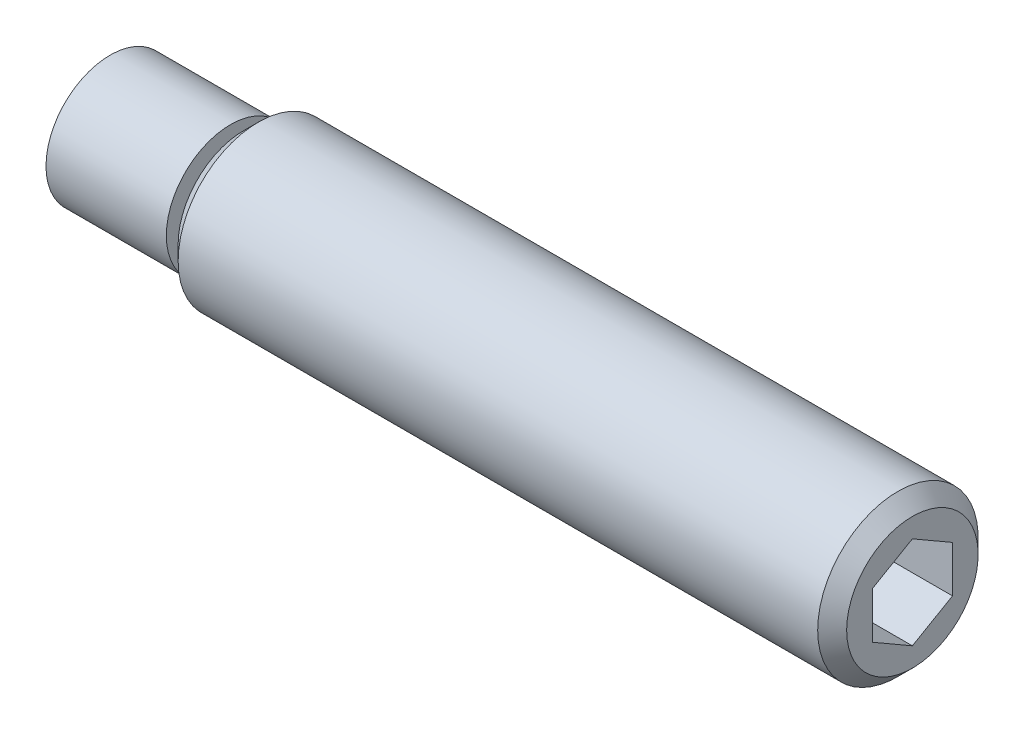
ISO-10303-21;
HEADER;
FILE_DESCRIPTION(('STEP AP214'),'2;1');
FILE_NAME('part.step','',(''),(''),'','','');
FILE_SCHEMA(('AUTOMOTIVE_DESIGN { 1 0 10303 214 1 1 1 1 }'));
ENDSEC;
DATA;
#1=APPLICATION_CONTEXT('core data for automotive mechanical design processes');
#2=APPLICATION_PROTOCOL_DEFINITION('international standard','automotive_design',2000,#1);
#3=PRODUCT_CONTEXT('',#1,'mechanical');
#4=PRODUCT('Part','Part','',(#3));
#5=PRODUCT_RELATED_PRODUCT_CATEGORY('part','',(#4));
#6=PRODUCT_DEFINITION_FORMATION('','',#4);
#7=PRODUCT_DEFINITION_CONTEXT('part definition',#1,'design');
#8=PRODUCT_DEFINITION('design','',#6,#7);
#9=PRODUCT_DEFINITION_SHAPE('','',#8);
#10=(LENGTH_UNIT() NAMED_UNIT(*) SI_UNIT(.MILLI.,.METRE.));
#11=(NAMED_UNIT(*) PLANE_ANGLE_UNIT() SI_UNIT($,.RADIAN.));
#12=(NAMED_UNIT(*) SI_UNIT($,.STERADIAN.) SOLID_ANGLE_UNIT());
#13=UNCERTAINTY_MEASURE_WITH_UNIT(LENGTH_MEASURE(1.E-05),#10,'distance_accuracy_value','');
#14=(GEOMETRIC_REPRESENTATION_CONTEXT(3) GLOBAL_UNCERTAINTY_ASSIGNED_CONTEXT((#13)) GLOBAL_UNIT_ASSIGNED_CONTEXT((#10,
#11,#12)) REPRESENTATION_CONTEXT('',''));
#15=CARTESIAN_POINT('',(0.,0.,0.));
#16=DIRECTION('',(0.,0.,1.));
#17=DIRECTION('',(1.,0.,0.));
#18=AXIS2_PLACEMENT_3D('',#15,#16,#17);
#19=CARTESIAN_POINT('',(25.,2.4585,0.));
#20=DIRECTION('',(-1.,0.,0.));
#21=DIRECTION('',(0.,0.,1.));
#22=AXIS2_PLACEMENT_3D('',#19,#20,#21);
#23=PLANE('',#22);
#24=CARTESIAN_POINT('',(25.,0.,0.));
#25=DIRECTION('',(-1.,0.,0.));
#26=DIRECTION('',(0.,0.,1.));
#27=AXIS2_PLACEMENT_3D('',#24,#25,#26);
#28=CIRCLE('',#27,2.4585);
#29=CARTESIAN_POINT('',(25.,0.,2.4585));
#30=VERTEX_POINT('',#29);
#31=EDGE_CURVE('E175',#30,#30,#28,.T.);
#32=ORIENTED_EDGE('',*,*,#31,.F.);
#33=EDGE_LOOP('',(#32));
#34=FACE_BOUND('',#33,.T.);
#35=DIRECTION('',(0.,-1.,0.));
#36=VECTOR('',#35,1.);
#37=CARTESIAN_POINT('',(25.,0.866025403784439,1.5));
#38=LINE('',#37,#36);
#39=CARTESIAN_POINT('',(25.,0.866025403784439,1.5));
#40=VERTEX_POINT('',#39);
#41=CARTESIAN_POINT('',(25.,-0.866025403784439,1.5));
#42=VERTEX_POINT('',#41);
#43=EDGE_CURVE('E150',#40,#42,#38,.T.);
#44=ORIENTED_EDGE('',*,*,#43,.F.);
#45=DIRECTION('',(0.,-0.5,0.866025403784439));
#46=VECTOR('',#45,1.);
#47=CARTESIAN_POINT('',(25.,1.73205080756888,0.));
#48=LINE('',#47,#46);
#49=CARTESIAN_POINT('',(25.,1.73205080756888,0.));
#50=VERTEX_POINT('',#49);
#51=EDGE_CURVE('E51',#50,#40,#48,.T.);
#52=ORIENTED_EDGE('',*,*,#51,.F.);
#53=DIRECTION('',(0.,0.5,0.866025403784439));
#54=VECTOR('',#53,1.);
#55=CARTESIAN_POINT('',(25.,0.866025403784439,-1.5));
#56=LINE('',#55,#54);
#57=CARTESIAN_POINT('',(25.,0.866025403784439,-1.5));
#58=VERTEX_POINT('',#57);
#59=EDGE_CURVE('E121',#58,#50,#56,.T.);
#60=ORIENTED_EDGE('',*,*,#59,.F.);
#61=DIRECTION('',(0.,1.,0.));
#62=VECTOR('',#61,1.);
#63=CARTESIAN_POINT('',(25.,-0.866025403784439,-1.5));
#64=LINE('',#63,#62);
#65=CARTESIAN_POINT('',(25.,-0.866025403784439,-1.5));
#66=VERTEX_POINT('',#65);
#67=EDGE_CURVE('E157',#66,#58,#64,.T.);
#68=ORIENTED_EDGE('',*,*,#67,.F.);
#69=DIRECTION('',(0.,0.5,-0.866025403784439));
#70=VECTOR('',#69,1.);
#71=CARTESIAN_POINT('',(25.,-1.73205080756888,0.));
#72=LINE('',#71,#70);
#73=CARTESIAN_POINT('',(25.,-1.73205080756888,0.));
#74=VERTEX_POINT('',#73);
#75=EDGE_CURVE('E154',#74,#66,#72,.T.);
#76=ORIENTED_EDGE('',*,*,#75,.F.);
#77=DIRECTION('',(0.,-0.5,-0.866025403784439));
#78=VECTOR('',#77,1.);
#79=CARTESIAN_POINT('',(25.,-0.866025403784439,1.5));
#80=LINE('',#79,#78);
#81=EDGE_CURVE('E152',#42,#74,#80,.T.);
#82=ORIENTED_EDGE('',*,*,#81,.F.);
#83=EDGE_LOOP('',(#44,#52,#60,#68,#76,#82));
#84=FACE_BOUND('',#83,.T.);
#85=ADVANCED_FACE('F36',(#34,#84),#23,.F.);
#86=CARTESIAN_POINT('',(-5.,0.,0.));
#87=DIRECTION('',(1.,0.,0.));
#88=DIRECTION('',(0.,0.,-1.));
#89=AXIS2_PLACEMENT_3D('',#86,#87,#88);
#90=PLANE('',#89);
#91=CARTESIAN_POINT('',(-5.,0.,0.));
#92=DIRECTION('',(-1.,0.,0.));
#93=DIRECTION('',(0.,0.,1.));
#94=AXIS2_PLACEMENT_3D('',#91,#92,#93);
#95=CIRCLE('',#94,2.4);
#96=CARTESIAN_POINT('',(-5.,0.,2.4));
#97=VERTEX_POINT('',#96);
#98=EDGE_CURVE('E11',#97,#97,#95,.T.);
#99=ORIENTED_EDGE('',*,*,#98,.T.);
#100=EDGE_LOOP('',(#99));
#101=FACE_BOUND('',#100,.T.);
#102=ADVANCED_FACE('F38',(#101),#90,.F.);
#103=CARTESIAN_POINT('',(25.,0.,0.));
#104=DIRECTION('',(-1.,0.,0.));
#105=DIRECTION('',(0.,0.,1.));
#106=AXIS2_PLACEMENT_3D('',#103,#104,#105);
#107=CYLINDRICAL_SURFACE('',#106,2.4);
#108=ORIENTED_EDGE('',*,*,#98,.F.);
#109=EDGE_LOOP('',(#108));
#110=FACE_BOUND('',#109,.T.);
#111=CARTESIAN_POINT('',(-0.5,0.,0.));
#112=DIRECTION('',(-1.,0.,0.));
#113=DIRECTION('',(0.,0.,1.));
#114=AXIS2_PLACEMENT_3D('',#111,#112,#113);
#115=CIRCLE('',#114,2.4);
#116=CARTESIAN_POINT('',(-0.5,0.,2.4));
#117=VERTEX_POINT('',#116);
#118=EDGE_CURVE('E44',#117,#117,#115,.T.);
#119=ORIENTED_EDGE('',*,*,#118,.T.);
#120=EDGE_LOOP('',(#119));
#121=FACE_BOUND('',#120,.T.);
#122=ADVANCED_FACE('F196',(#110,#121),#107,.T.);
#123=CARTESIAN_POINT('',(-0.5,2.4,0.));
#124=DIRECTION('',(-1.,0.,0.));
#125=DIRECTION('',(0.,0.,1.));
#126=AXIS2_PLACEMENT_3D('',#123,#124,#125);
#127=PLANE('',#126);
#128=ORIENTED_EDGE('',*,*,#118,.F.);
#129=EDGE_LOOP('',(#128));
#130=FACE_BOUND('',#129,.T.);
#131=CARTESIAN_POINT('',(-0.5,0.,0.));
#132=DIRECTION('',(-1.,0.,0.));
#133=DIRECTION('',(0.,0.,1.));
#134=AXIS2_PLACEMENT_3D('',#131,#132,#133);
#135=CIRCLE('',#134,1.5);
#136=CARTESIAN_POINT('',(-0.5,0.,1.5));
#137=VERTEX_POINT('',#136);
#138=EDGE_CURVE('E191',#137,#137,#135,.T.);
#139=ORIENTED_EDGE('',*,*,#138,.T.);
#140=EDGE_LOOP('',(#139));
#141=FACE_BOUND('',#140,.T.);
#142=ADVANCED_FACE('F198',(#130,#141),#127,.F.);
#143=CARTESIAN_POINT('',(25.,0.,0.));
#144=DIRECTION('',(-1.,0.,0.));
#145=DIRECTION('',(0.,0.,1.));
#146=AXIS2_PLACEMENT_3D('',#143,#144,#145);
#147=CYLINDRICAL_SURFACE('',#146,1.5);
#148=ORIENTED_EDGE('',*,*,#138,.F.);
#149=EDGE_LOOP('',(#148));
#150=FACE_BOUND('',#149,.T.);
#151=CARTESIAN_POINT('',(0.,0.,0.));
#152=DIRECTION('',(-1.,0.,0.));
#153=DIRECTION('',(0.,0.,1.));
#154=AXIS2_PLACEMENT_3D('',#151,#152,#153);
#155=CIRCLE('',#154,1.5);
#156=CARTESIAN_POINT('',(0.,0.,1.5));
#157=VERTEX_POINT('',#156);
#158=EDGE_CURVE('E188',#157,#157,#155,.T.);
#159=ORIENTED_EDGE('',*,*,#158,.T.);
#160=EDGE_LOOP('',(#159));
#161=FACE_BOUND('',#160,.T.);
#162=ADVANCED_FACE('F201',(#150,#161),#147,.T.);
#163=CARTESIAN_POINT('',(0.,1.5,0.));
#164=DIRECTION('',(1.,0.,0.));
#165=DIRECTION('',(0.,0.,-1.));
#166=AXIS2_PLACEMENT_3D('',#163,#164,#165);
#167=PLANE('',#166);
#168=ORIENTED_EDGE('',*,*,#158,.F.);
#169=EDGE_LOOP('',(#168));
#170=FACE_BOUND('',#169,.T.);
#171=CARTESIAN_POINT('',(0.,0.,0.));
#172=DIRECTION('',(-1.,0.,0.));
#173=DIRECTION('',(0.,0.,1.));
#174=AXIS2_PLACEMENT_3D('',#171,#172,#173);
#175=CIRCLE('',#174,2.4585);
#176=CARTESIAN_POINT('',(0.,0.,2.4585));
#177=VERTEX_POINT('',#176);
#178=EDGE_CURVE('E185',#177,#177,#175,.T.);
#179=ORIENTED_EDGE('',*,*,#178,.T.);
#180=EDGE_LOOP('',(#179));
#181=FACE_BOUND('',#180,.T.);
#182=ADVANCED_FACE('F207',(#170,#181),#167,.F.);
#183=CARTESIAN_POINT('',(0.541500000000004,0.,0.));
#184=DIRECTION('',(1.,0.,0.));
#185=DIRECTION('',(0.,0.,-1.));
#186=AXIS2_PLACEMENT_3D('',#183,#184,#185);
#187=CONICAL_SURFACE('',#186,3.,0.785398163397445);
#188=ORIENTED_EDGE('',*,*,#178,.F.);
#189=EDGE_LOOP('',(#188));
#190=FACE_BOUND('',#189,.T.);
#191=CARTESIAN_POINT('',(0.541500000000004,0.,0.));
#192=DIRECTION('',(-1.,0.,0.));
#193=DIRECTION('',(0.,0.,1.));
#194=AXIS2_PLACEMENT_3D('',#191,#192,#193);
#195=CIRCLE('',#194,3.);
#196=CARTESIAN_POINT('',(0.541500000000004,0.,3.));
#197=VERTEX_POINT('',#196);
#198=EDGE_CURVE('E182',#197,#197,#195,.T.);
#199=ORIENTED_EDGE('',*,*,#198,.T.);
#200=EDGE_LOOP('',(#199));
#201=FACE_BOUND('',#200,.T.);
#202=ADVANCED_FACE('F213',(#190,#201),#187,.T.);
#203=CARTESIAN_POINT('',(25.,0.,0.));
#204=DIRECTION('',(-1.,0.,0.));
#205=DIRECTION('',(0.,0.,1.));
#206=AXIS2_PLACEMENT_3D('',#203,#204,#205);
#207=CYLINDRICAL_SURFACE('',#206,3.);
#208=ORIENTED_EDGE('',*,*,#198,.F.);
#209=EDGE_LOOP('',(#208));
#210=FACE_BOUND('',#209,.T.);
#211=CARTESIAN_POINT('',(24.4585,0.,0.));
#212=DIRECTION('',(-1.,0.,0.));
#213=DIRECTION('',(0.,0.,1.));
#214=AXIS2_PLACEMENT_3D('',#211,#212,#213);
#215=CIRCLE('',#214,3.);
#216=CARTESIAN_POINT('',(24.4585,0.,3.));
#217=VERTEX_POINT('',#216);
#218=EDGE_CURVE('E179',#217,#217,#215,.T.);
#219=ORIENTED_EDGE('',*,*,#218,.T.);
#220=EDGE_LOOP('',(#219));
#221=FACE_BOUND('',#220,.T.);
#222=ADVANCED_FACE('F219',(#210,#221),#207,.T.);
#223=CARTESIAN_POINT('',(25.,0.,0.));
#224=DIRECTION('',(-1.,0.,0.));
#225=DIRECTION('',(0.,0.,1.));
#226=AXIS2_PLACEMENT_3D('',#223,#224,#225);
#227=CONICAL_SURFACE('',#226,2.4585,0.785398163397448);
#228=ORIENTED_EDGE('',*,*,#218,.F.);
#229=EDGE_LOOP('',(#228));
#230=FACE_BOUND('',#229,.T.);
#231=ORIENTED_EDGE('',*,*,#31,.T.);
#232=EDGE_LOOP('',(#231));
#233=FACE_BOUND('',#232,.T.);
#234=ADVANCED_FACE('F225',(#230,#233),#227,.T.);
#235=CARTESIAN_POINT('',(22.,1.73205080756888,0.));
#236=DIRECTION('',(0.,0.866025403784439,0.5));
#237=DIRECTION('',(0.,-0.5,0.866025403784439));
#238=AXIS2_PLACEMENT_3D('',#235,#236,#237);
#239=PLANE('',#238);
#240=ORIENTED_EDGE('',*,*,#51,.T.);
#241=DIRECTION('',(1.,0.,0.));
#242=VECTOR('',#241,1.);
#243=CARTESIAN_POINT('',(22.,0.866025403784439,1.5));
#244=LINE('',#243,#242);
#245=CARTESIAN_POINT('',(22.,0.866025403784439,1.5));
#246=VERTEX_POINT('',#245);
#247=EDGE_CURVE('E123',#246,#40,#244,.T.);
#248=ORIENTED_EDGE('',*,*,#247,.F.);
#249=DIRECTION('',(0.,-0.5,0.866025403784439));
#250=VECTOR('',#249,1.);
#251=CARTESIAN_POINT('',(22.,1.73205080756888,0.));
#252=LINE('',#251,#250);
#253=CARTESIAN_POINT('',(22.,1.29903810567666,0.75));
#254=VERTEX_POINT('',#253);
#255=EDGE_CURVE('E112',#254,#246,#252,.T.);
#256=ORIENTED_EDGE('',*,*,#255,.F.);
#257=CARTESIAN_POINT('',(22.,1.73205080756888,0.));
#258=VERTEX_POINT('',#257);
#259=EDGE_CURVE('E120',#258,#254,#252,.T.);
#260=ORIENTED_EDGE('',*,*,#259,.F.);
#261=DIRECTION('',(1.,0.,0.));
#262=VECTOR('',#261,1.);
#263=CARTESIAN_POINT('',(22.,1.73205080756888,0.));
#264=LINE('',#263,#262);
#265=EDGE_CURVE('E160',#258,#50,#264,.T.);
#266=ORIENTED_EDGE('',*,*,#265,.T.);
#267=EDGE_LOOP('',(#240,#248,#256,#260,#266));
#268=FACE_BOUND('',#267,.T.);
#269=ADVANCED_FACE('F124',(#268),#239,.F.);
#270=CARTESIAN_POINT('',(22.,0.866025403784439,-1.5));
#271=DIRECTION('',(0.,0.866025403784439,-0.5));
#272=DIRECTION('',(0.,0.5,0.866025403784439));
#273=AXIS2_PLACEMENT_3D('',#270,#271,#272);
#274=PLANE('',#273);
#275=ORIENTED_EDGE('',*,*,#59,.T.);
#276=ORIENTED_EDGE('',*,*,#265,.F.);
#277=DIRECTION('',(0.,0.5,0.866025403784439));
#278=VECTOR('',#277,1.);
#279=CARTESIAN_POINT('',(22.,0.866025403784439,-1.5));
#280=LINE('',#279,#278);
#281=CARTESIAN_POINT('',(22.,1.29903810567666,-0.75));
#282=VERTEX_POINT('',#281);
#283=EDGE_CURVE('E146',#282,#258,#280,.T.);
#284=ORIENTED_EDGE('',*,*,#283,.F.);
#285=CARTESIAN_POINT('',(22.,0.866025403784439,-1.5));
#286=VERTEX_POINT('',#285);
#287=EDGE_CURVE('E128',#286,#282,#280,.T.);
#288=ORIENTED_EDGE('',*,*,#287,.F.);
#289=DIRECTION('',(1.,0.,0.));
#290=VECTOR('',#289,1.);
#291=CARTESIAN_POINT('',(22.,0.866025403784439,-1.5));
#292=LINE('',#291,#290);
#293=EDGE_CURVE('E163',#286,#58,#292,.T.);
#294=ORIENTED_EDGE('',*,*,#293,.T.);
#295=EDGE_LOOP('',(#275,#276,#284,#288,#294));
#296=FACE_BOUND('',#295,.T.);
#297=ADVANCED_FACE('F267',(#296),#274,.F.);
#298=CARTESIAN_POINT('',(22.,-0.866025403784439,-1.5));
#299=DIRECTION('',(0.,0.,-1.));
#300=DIRECTION('',(-1.,0.,0.));
#301=AXIS2_PLACEMENT_3D('',#298,#299,#300);
#302=PLANE('',#301);
#303=ORIENTED_EDGE('',*,*,#67,.T.);
#304=ORIENTED_EDGE('',*,*,#293,.F.);
#305=DIRECTION('',(0.,1.,0.));
#306=VECTOR('',#305,1.);
#307=CARTESIAN_POINT('',(22.,-0.866025403784439,-1.5));
#308=LINE('',#307,#306);
#309=CARTESIAN_POINT('',(22.,0.,-1.5));
#310=VERTEX_POINT('',#309);
#311=EDGE_CURVE('E144',#310,#286,#308,.T.);
#312=ORIENTED_EDGE('',*,*,#311,.F.);
#313=CARTESIAN_POINT('',(22.,-0.866025403784439,-1.5));
#314=VERTEX_POINT('',#313);
#315=EDGE_CURVE('E59',#314,#310,#308,.T.);
#316=ORIENTED_EDGE('',*,*,#315,.F.);
#317=DIRECTION('',(1.,0.,0.));
#318=VECTOR('',#317,1.);
#319=CARTESIAN_POINT('',(22.,-0.866025403784439,-1.5));
#320=LINE('',#319,#318);
#321=EDGE_CURVE('E166',#314,#66,#320,.T.);
#322=ORIENTED_EDGE('',*,*,#321,.T.);
#323=EDGE_LOOP('',(#303,#304,#312,#316,#322));
#324=FACE_BOUND('',#323,.T.);
#325=ADVANCED_FACE('F271',(#324),#302,.F.);
#326=CARTESIAN_POINT('',(22.,-1.73205080756888,0.));
#327=DIRECTION('',(0.,-0.866025403784439,-0.5));
#328=DIRECTION('',(0.,0.5,-0.866025403784439));
#329=AXIS2_PLACEMENT_3D('',#326,#327,#328);
#330=PLANE('',#329);
#331=ORIENTED_EDGE('',*,*,#75,.T.);
#332=ORIENTED_EDGE('',*,*,#321,.F.);
#333=DIRECTION('',(0.,0.5,-0.866025403784439));
#334=VECTOR('',#333,1.);
#335=CARTESIAN_POINT('',(22.,-1.73205080756888,0.));
#336=LINE('',#335,#334);
#337=CARTESIAN_POINT('',(22.,-1.29903810567666,-0.75));
#338=VERTEX_POINT('',#337);
#339=EDGE_CURVE('E140',#338,#314,#336,.T.);
#340=ORIENTED_EDGE('',*,*,#339,.F.);
#341=CARTESIAN_POINT('',(22.,-1.73205080756888,0.));
#342=VERTEX_POINT('',#341);
#343=EDGE_CURVE('E141',#342,#338,#336,.T.);
#344=ORIENTED_EDGE('',*,*,#343,.F.);
#345=DIRECTION('',(1.,0.,0.));
#346=VECTOR('',#345,1.);
#347=CARTESIAN_POINT('',(22.,-1.73205080756888,0.));
#348=LINE('',#347,#346);
#349=EDGE_CURVE('E169',#342,#74,#348,.T.);
#350=ORIENTED_EDGE('',*,*,#349,.T.);
#351=EDGE_LOOP('',(#331,#332,#340,#344,#350));
#352=FACE_BOUND('',#351,.T.);
#353=ADVANCED_FACE('F274',(#352),#330,.F.);
#354=CARTESIAN_POINT('',(22.,-0.866025403784439,1.5));
#355=DIRECTION('',(0.,-0.866025403784439,0.5));
#356=DIRECTION('',(0.,-0.5,-0.866025403784439));
#357=AXIS2_PLACEMENT_3D('',#354,#355,#356);
#358=PLANE('',#357);
#359=ORIENTED_EDGE('',*,*,#81,.T.);
#360=ORIENTED_EDGE('',*,*,#349,.F.);
#361=DIRECTION('',(0.,-0.5,-0.866025403784439));
#362=VECTOR('',#361,1.);
#363=CARTESIAN_POINT('',(22.,-0.866025403784439,1.5));
#364=LINE('',#363,#362);
#365=CARTESIAN_POINT('',(22.,-1.29903810567666,0.75));
#366=VERTEX_POINT('',#365);
#367=EDGE_CURVE('E134',#366,#342,#364,.T.);
#368=ORIENTED_EDGE('',*,*,#367,.F.);
#369=CARTESIAN_POINT('',(22.,-0.866025403784439,1.5));
#370=VERTEX_POINT('',#369);
#371=EDGE_CURVE('E136',#370,#366,#364,.T.);
#372=ORIENTED_EDGE('',*,*,#371,.F.);
#373=DIRECTION('',(1.,0.,0.));
#374=VECTOR('',#373,1.);
#375=CARTESIAN_POINT('',(22.,-0.866025403784439,1.5));
#376=LINE('',#375,#374);
#377=EDGE_CURVE('E127',#370,#42,#376,.T.);
#378=ORIENTED_EDGE('',*,*,#377,.T.);
#379=EDGE_LOOP('',(#359,#360,#368,#372,#378));
#380=FACE_BOUND('',#379,.T.);
#381=ADVANCED_FACE('F242',(#380),#358,.F.);
#382=CARTESIAN_POINT('',(22.,0.866025403784439,1.5));
#383=DIRECTION('',(0.,0.,1.));
#384=DIRECTION('',(1.,0.,0.));
#385=AXIS2_PLACEMENT_3D('',#382,#383,#384);
#386=PLANE('',#385);
#387=ORIENTED_EDGE('',*,*,#43,.T.);
#388=ORIENTED_EDGE('',*,*,#377,.F.);
#389=DIRECTION('',(0.,-1.,0.));
#390=VECTOR('',#389,1.);
#391=CARTESIAN_POINT('',(22.,0.866025403784439,1.5));
#392=LINE('',#391,#390);
#393=CARTESIAN_POINT('',(22.,0.,1.5));
#394=VERTEX_POINT('',#393);
#395=EDGE_CURVE('E133',#394,#370,#392,.T.);
#396=ORIENTED_EDGE('',*,*,#395,.F.);
#397=EDGE_CURVE('E115',#246,#394,#392,.T.);
#398=ORIENTED_EDGE('',*,*,#397,.F.);
#399=ORIENTED_EDGE('',*,*,#247,.T.);
#400=EDGE_LOOP('',(#387,#388,#396,#398,#399));
#401=FACE_BOUND('',#400,.T.);
#402=ADVANCED_FACE('F131',(#401),#386,.F.);
#403=CARTESIAN_POINT('',(22.,0.866025403784438,1.5));
#404=DIRECTION('',(1.,0.,0.));
#405=DIRECTION('',(0.,0.,-1.));
#406=AXIS2_PLACEMENT_3D('',#403,#404,#405);
#407=PLANE('',#406);
#408=ORIENTED_EDGE('',*,*,#311,.T.);
#409=ORIENTED_EDGE('',*,*,#287,.T.);
#410=CARTESIAN_POINT('',(22.,0.,0.));
#411=DIRECTION('',(-1.,0.,0.));
#412=DIRECTION('',(0.,0.,1.));
#413=AXIS2_PLACEMENT_3D('',#410,#411,#412);
#414=CIRCLE('',#413,1.5);
#415=EDGE_CURVE('E256',#282,#310,#414,.T.);
#416=ORIENTED_EDGE('',*,*,#415,.T.);
#417=EDGE_LOOP('',(#408,#409,#416));
#418=FACE_BOUND('',#417,.T.);
#419=ADVANCED_FACE('F268',(#418),#407,.T.);
#420=ORIENTED_EDGE('',*,*,#283,.T.);
#421=ORIENTED_EDGE('',*,*,#259,.T.);
#422=EDGE_CURVE('E176',#254,#282,#414,.T.);
#423=ORIENTED_EDGE('',*,*,#422,.T.);
#424=EDGE_LOOP('',(#420,#421,#423));
#425=FACE_BOUND('',#424,.T.);
#426=ADVANCED_FACE('F263',(#425),#407,.T.);
#427=ORIENTED_EDGE('',*,*,#255,.T.);
#428=ORIENTED_EDGE('',*,*,#397,.T.);
#429=EDGE_CURVE('E117',#394,#254,#414,.T.);
#430=ORIENTED_EDGE('',*,*,#429,.T.);
#431=EDGE_LOOP('',(#427,#428,#430));
#432=FACE_BOUND('',#431,.T.);
#433=ADVANCED_FACE('F113',(#432),#407,.T.);
#434=ORIENTED_EDGE('',*,*,#395,.T.);
#435=ORIENTED_EDGE('',*,*,#371,.T.);
#436=EDGE_CURVE('E162',#366,#394,#414,.T.);
#437=ORIENTED_EDGE('',*,*,#436,.T.);
#438=EDGE_LOOP('',(#434,#435,#437));
#439=FACE_BOUND('',#438,.T.);
#440=ADVANCED_FACE('F247',(#439),#407,.T.);
#441=ORIENTED_EDGE('',*,*,#367,.T.);
#442=ORIENTED_EDGE('',*,*,#343,.T.);
#443=EDGE_CURVE('E252',#338,#366,#414,.T.);
#444=ORIENTED_EDGE('',*,*,#443,.T.);
#445=EDGE_LOOP('',(#441,#442,#444));
#446=FACE_BOUND('',#445,.T.);
#447=ADVANCED_FACE('F276',(#446),#407,.T.);
#448=ORIENTED_EDGE('',*,*,#339,.T.);
#449=ORIENTED_EDGE('',*,*,#315,.T.);
#450=EDGE_CURVE('E254',#310,#338,#414,.T.);
#451=ORIENTED_EDGE('',*,*,#450,.T.);
#452=EDGE_LOOP('',(#448,#449,#451));
#453=FACE_BOUND('',#452,.T.);
#454=ADVANCED_FACE('F278',(#453),#407,.T.);
#455=CARTESIAN_POINT('',(22.,0.,0.));
#456=DIRECTION('',(1.,0.,0.));
#457=DIRECTION('',(0.,0.,-1.));
#458=AXIS2_PLACEMENT_3D('',#455,#456,#457);
#459=CONICAL_SURFACE('',#458,1.5,1.0471975511966);
#460=CARTESIAN_POINT('',(21.1339745962156,0.,0.));
#461=VERTEX_POINT('',#460);
#462=VERTEX_LOOP('',#461);
#463=FACE_BOUND('',#462,.T.);
#464=ORIENTED_EDGE('',*,*,#429,.F.);
#465=ORIENTED_EDGE('',*,*,#436,.F.);
#466=ORIENTED_EDGE('',*,*,#443,.F.);
#467=ORIENTED_EDGE('',*,*,#450,.F.);
#468=ORIENTED_EDGE('',*,*,#415,.F.);
#469=ORIENTED_EDGE('',*,*,#422,.F.);
#470=EDGE_LOOP('',(#464,#465,#466,#467,#468,#469));
#471=FACE_BOUND('',#470,.T.);
#472=ADVANCED_FACE('F250',(#463,#471),#459,.F.);
#473=CLOSED_SHELL('',(#85,#102,#122,#142,#162,#182,#202,#222,#234,#269,#297,#325,#353,#381,#402,
#419,#426,#433,#440,#447,#454,#472));
#474=MANIFOLD_SOLID_BREP('B2',#473);
#475=ADVANCED_BREP_SHAPE_REPRESENTATION('',(#18,#474),#14);
#476=SHAPE_DEFINITION_REPRESENTATION(#9,#475);
ENDSEC;
END-ISO-10303-21;
